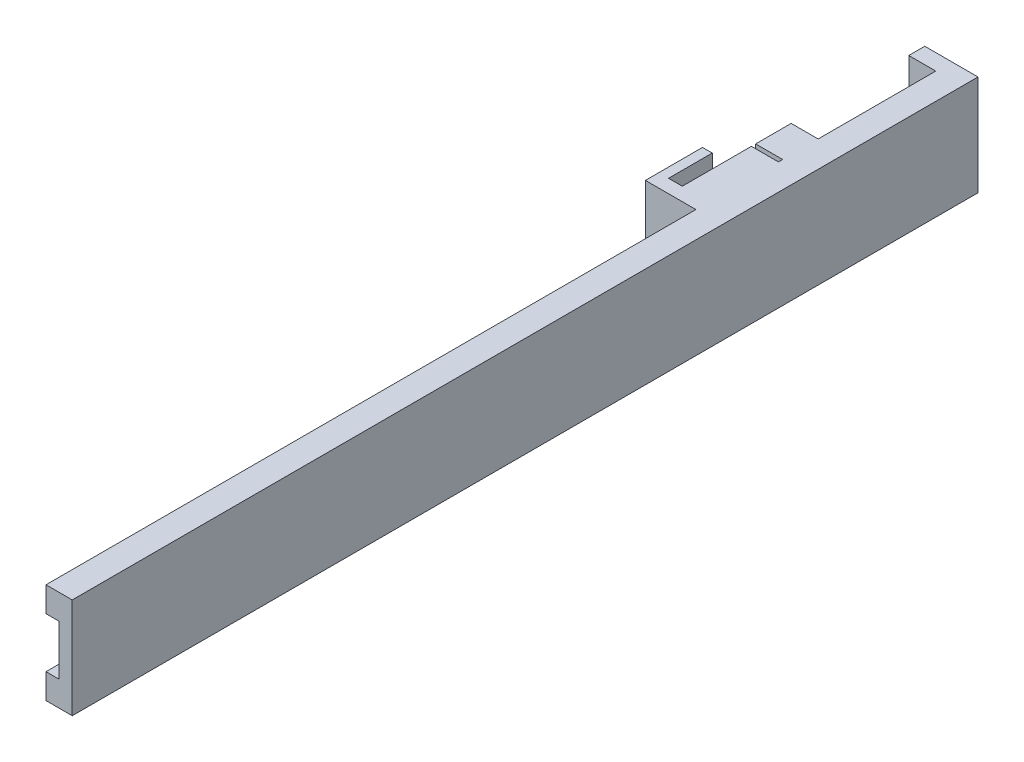
ISO-10303-21;
HEADER;
FILE_DESCRIPTION(('STEP AP214'),'2;1');
FILE_NAME('part.step','',(''),(''),'','','');
FILE_SCHEMA(('AUTOMOTIVE_DESIGN { 1 0 10303 214 1 1 1 1 }'));
ENDSEC;
DATA;
#1=APPLICATION_CONTEXT('core data for automotive mechanical design processes');
#2=APPLICATION_PROTOCOL_DEFINITION('international standard','automotive_design',2000,#1);
#3=PRODUCT_CONTEXT('',#1,'mechanical');
#4=PRODUCT('Part','Part','',(#3));
#5=PRODUCT_RELATED_PRODUCT_CATEGORY('part','',(#4));
#6=PRODUCT_DEFINITION_FORMATION('','',#4);
#7=PRODUCT_DEFINITION_CONTEXT('part definition',#1,'design');
#8=PRODUCT_DEFINITION('design','',#6,#7);
#9=PRODUCT_DEFINITION_SHAPE('','',#8);
#10=(LENGTH_UNIT() NAMED_UNIT(*) SI_UNIT(.MILLI.,.METRE.));
#11=(NAMED_UNIT(*) PLANE_ANGLE_UNIT() SI_UNIT($,.RADIAN.));
#12=(NAMED_UNIT(*) SI_UNIT($,.STERADIAN.) SOLID_ANGLE_UNIT());
#13=UNCERTAINTY_MEASURE_WITH_UNIT(LENGTH_MEASURE(1.E-05),#10,'distance_accuracy_value','');
#14=(GEOMETRIC_REPRESENTATION_CONTEXT(3) GLOBAL_UNCERTAINTY_ASSIGNED_CONTEXT((#13)) GLOBAL_UNIT_ASSIGNED_CONTEXT((#10,
#11,#12)) REPRESENTATION_CONTEXT('',''));
#15=CARTESIAN_POINT('',(0.,0.,0.));
#16=DIRECTION('',(0.,0.,1.));
#17=DIRECTION('',(1.,0.,0.));
#18=AXIS2_PLACEMENT_3D('',#15,#16,#17);
#19=CARTESIAN_POINT('',(5.86964679662599,11.6586,0.));
#20=DIRECTION('',(-1.,0.,0.));
#21=DIRECTION('',(0.,0.,1.));
#22=AXIS2_PLACEMENT_3D('',#19,#20,#21);
#23=PLANE('',#22);
#24=DIRECTION('',(0.,1.,0.));
#25=VECTOR('',#24,1.);
#26=CARTESIAN_POINT('',(5.86964679662599,11.6586,51.6734002204515));
#27=LINE('',#26,#25);
#28=CARTESIAN_POINT('',(5.86964679662599,2.91465,51.6734002204515));
#29=VERTEX_POINT('',#28);
#30=CARTESIAN_POINT('',(5.86964679662599,8.74395,51.6734002204515));
#31=VERTEX_POINT('',#30);
#32=EDGE_CURVE('E190',#29,#31,#27,.T.);
#33=ORIENTED_EDGE('',*,*,#32,.T.);
#34=DIRECTION('',(0.,0.,1.));
#35=VECTOR('',#34,1.);
#36=CARTESIAN_POINT('',(5.86964679662599,8.74395,51.6734002204515));
#37=LINE('',#36,#35);
#38=CARTESIAN_POINT('',(5.86964679662599,8.74395,77.0734002204515));
#39=VERTEX_POINT('',#38);
#40=EDGE_CURVE('E196',#31,#39,#37,.T.);
#41=ORIENTED_EDGE('',*,*,#40,.T.);
#42=DIRECTION('',(0.,-1.,0.));
#43=VECTOR('',#42,1.);
#44=CARTESIAN_POINT('',(5.86964679662599,11.6586,77.0734002204515));
#45=LINE('',#44,#43);
#46=CARTESIAN_POINT('',(5.86964679662599,11.6586,77.0734002204515));
#47=VERTEX_POINT('',#46);
#48=EDGE_CURVE('E342',#47,#39,#45,.T.);
#49=ORIENTED_EDGE('',*,*,#48,.F.);
#50=DIRECTION('',(0.,0.,-1.));
#51=VECTOR('',#50,1.);
#52=CARTESIAN_POINT('',(5.86964679662599,11.6586,0.));
#53=LINE('',#52,#51);
#54=CARTESIAN_POINT('',(5.86964679662599,11.6586,1.55606424717921));
#55=VERTEX_POINT('',#54);
#56=EDGE_CURVE('E267',#47,#55,#53,.T.);
#57=ORIENTED_EDGE('',*,*,#56,.T.);
#58=DIRECTION('',(0.,-1.,0.));
#59=VECTOR('',#58,1.);
#60=CARTESIAN_POINT('',(5.86964679662599,11.6586,1.55606424717921));
#61=LINE('',#60,#59);
#62=CARTESIAN_POINT('',(5.86964679662599,0.,1.55606424717921));
#63=VERTEX_POINT('',#62);
#64=EDGE_CURVE('E344',#55,#63,#61,.T.);
#65=ORIENTED_EDGE('',*,*,#64,.T.);
#66=DIRECTION('',(0.,0.,-1.));
#67=VECTOR('',#66,1.);
#68=CARTESIAN_POINT('',(5.86964679662599,0.,0.));
#69=LINE('',#68,#67);
#70=CARTESIAN_POINT('',(5.86964679662599,0.,77.0734002204515));
#71=VERTEX_POINT('',#70);
#72=EDGE_CURVE('E310',#71,#63,#69,.T.);
#73=ORIENTED_EDGE('',*,*,#72,.F.);
#74=CARTESIAN_POINT('',(5.86964679662599,2.91465,77.0734002204515));
#75=VERTEX_POINT('',#74);
#76=EDGE_CURVE('E341',#75,#71,#45,.T.);
#77=ORIENTED_EDGE('',*,*,#76,.F.);
#78=DIRECTION('',(0.,0.,1.));
#79=VECTOR('',#78,1.);
#80=CARTESIAN_POINT('',(5.86964679662599,2.91465,51.6734002204515));
#81=LINE('',#80,#79);
#82=EDGE_CURVE('E49',#29,#75,#81,.T.);
#83=ORIENTED_EDGE('',*,*,#82,.F.);
#84=EDGE_LOOP('',(#33,#41,#49,#57,#65,#73,#77,#83));
#85=FACE_BOUND('',#84,.T.);
#86=ADVANCED_FACE('F34',(#85),#23,.T.);
#87=CARTESIAN_POINT('',(0.,11.6586,77.0734002204515));
#88=DIRECTION('',(0.,0.,1.));
#89=DIRECTION('',(1.,0.,0.));
#90=AXIS2_PLACEMENT_3D('',#87,#88,#89);
#91=PLANE('',#90);
#92=ORIENTED_EDGE('',*,*,#48,.T.);
#93=DIRECTION('',(1.,0.,0.));
#94=VECTOR('',#93,1.);
#95=CARTESIAN_POINT('',(0.,8.74395,77.0734002204515));
#96=LINE('',#95,#94);
#97=CARTESIAN_POINT('',(7.39364679662599,8.74395,77.0734002204515));
#98=VERTEX_POINT('',#97);
#99=EDGE_CURVE('E199',#39,#98,#96,.T.);
#100=ORIENTED_EDGE('',*,*,#99,.T.);
#101=DIRECTION('',(0.,-1.,0.));
#102=VECTOR('',#101,1.);
#103=CARTESIAN_POINT('',(7.39364679662599,11.6586,77.0734002204515));
#104=LINE('',#103,#102);
#105=CARTESIAN_POINT('',(7.39364679662599,2.91465,77.0734002204515));
#106=VERTEX_POINT('',#105);
#107=EDGE_CURVE('E208',#98,#106,#104,.T.);
#108=ORIENTED_EDGE('',*,*,#107,.T.);
#109=DIRECTION('',(-1.,0.,0.));
#110=VECTOR('',#109,1.);
#111=CARTESIAN_POINT('',(0.,2.91465,77.0734002204515));
#112=LINE('',#111,#110);
#113=EDGE_CURVE('E206',#106,#75,#112,.T.);
#114=ORIENTED_EDGE('',*,*,#113,.T.);
#115=ORIENTED_EDGE('',*,*,#76,.T.);
#116=DIRECTION('',(-1.,0.,0.));
#117=VECTOR('',#116,1.);
#118=CARTESIAN_POINT('',(0.,0.,77.0734002204515));
#119=LINE('',#118,#117);
#120=CARTESIAN_POINT('',(8.91764679662599,0.,77.0734002204515));
#121=VERTEX_POINT('',#120);
#122=EDGE_CURVE('E313',#121,#71,#119,.T.);
#123=ORIENTED_EDGE('',*,*,#122,.F.);
#124=DIRECTION('',(0.,-1.,0.));
#125=VECTOR('',#124,1.);
#126=CARTESIAN_POINT('',(8.91764679662599,11.6586,77.0734002204515));
#127=LINE('',#126,#125);
#128=CARTESIAN_POINT('',(8.91764679662599,11.6586,77.0734002204515));
#129=VERTEX_POINT('',#128);
#130=EDGE_CURVE('E339',#129,#121,#127,.T.);
#131=ORIENTED_EDGE('',*,*,#130,.F.);
#132=DIRECTION('',(-1.,0.,0.));
#133=VECTOR('',#132,1.);
#134=CARTESIAN_POINT('',(0.,11.6586,77.0734002204515));
#135=LINE('',#134,#133);
#136=EDGE_CURVE('E270',#129,#47,#135,.T.);
#137=ORIENTED_EDGE('',*,*,#136,.T.);
#138=EDGE_LOOP('',(#92,#100,#108,#114,#115,#123,#131,#137));
#139=FACE_BOUND('',#138,.T.);
#140=ADVANCED_FACE('F392',(#139),#91,.T.);
#141=CARTESIAN_POINT('',(2.73274679662599,11.6586,0.));
#142=DIRECTION('',(-1.,0.,0.));
#143=DIRECTION('',(0.,0.,1.));
#144=AXIS2_PLACEMENT_3D('',#141,#142,#143);
#145=PLANE('',#144);
#146=DIRECTION('',(0.,0.,-1.));
#147=VECTOR('',#146,1.);
#148=CARTESIAN_POINT('',(2.73274679662599,0.,0.));
#149=LINE('',#148,#147);
#150=CARTESIAN_POINT('',(2.73274679662599,0.,-8.5217));
#151=VERTEX_POINT('',#150);
#152=CARTESIAN_POINT('',(2.73274679662599,0.,-12.6492));
#153=VERTEX_POINT('',#152);
#154=EDGE_CURVE('E291',#151,#153,#149,.T.);
#155=ORIENTED_EDGE('',*,*,#154,.F.);
#156=DIRECTION('',(0.,-1.,0.));
#157=VECTOR('',#156,1.);
#158=CARTESIAN_POINT('',(2.73274679662599,11.6586,-8.5217));
#159=LINE('',#158,#157);
#160=CARTESIAN_POINT('',(2.73274679662599,11.6586,-8.5217));
#161=VERTEX_POINT('',#160);
#162=EDGE_CURVE('E57',#161,#151,#159,.T.);
#163=ORIENTED_EDGE('',*,*,#162,.F.);
#164=DIRECTION('',(0.,0.,-1.));
#165=VECTOR('',#164,1.);
#166=CARTESIAN_POINT('',(2.73274679662599,11.6586,0.));
#167=LINE('',#166,#165);
#168=CARTESIAN_POINT('',(2.73274679662599,11.6586,-12.6492));
#169=VERTEX_POINT('',#168);
#170=EDGE_CURVE('E247',#161,#169,#167,.T.);
#171=ORIENTED_EDGE('',*,*,#170,.T.);
#172=DIRECTION('',(0.,-1.,0.));
#173=VECTOR('',#172,1.);
#174=CARTESIAN_POINT('',(2.73274679662599,11.6586,-12.6492));
#175=LINE('',#174,#173);
#176=EDGE_CURVE('E11',#169,#153,#175,.T.);
#177=ORIENTED_EDGE('',*,*,#176,.T.);
#178=EDGE_LOOP('',(#155,#163,#171,#177));
#179=FACE_BOUND('',#178,.T.);
#180=ADVANCED_FACE('F397',(#179),#145,.T.);
#181=CARTESIAN_POINT('',(0.,11.6586,-12.6492));
#182=DIRECTION('',(0.,0.,-1.));
#183=DIRECTION('',(-1.,0.,0.));
#184=AXIS2_PLACEMENT_3D('',#181,#182,#183);
#185=PLANE('',#184);
#186=DIRECTION('',(1.,0.,0.));
#187=VECTOR('',#186,1.);
#188=CARTESIAN_POINT('',(0.,0.,-12.6492));
#189=LINE('',#188,#187);
#190=CARTESIAN_POINT('',(5.86964679662599,0.,-12.6492));
#191=VERTEX_POINT('',#190);
#192=EDGE_CURVE('E243',#153,#191,#189,.T.);
#193=ORIENTED_EDGE('',*,*,#192,.F.);
#194=ORIENTED_EDGE('',*,*,#176,.F.);
#195=DIRECTION('',(1.,0.,0.));
#196=VECTOR('',#195,1.);
#197=CARTESIAN_POINT('',(0.,11.6586,-12.6492));
#198=LINE('',#197,#196);
#199=CARTESIAN_POINT('',(5.86964679662599,11.6586,-12.6492));
#200=VERTEX_POINT('',#199);
#201=EDGE_CURVE('E244',#169,#200,#198,.T.);
#202=ORIENTED_EDGE('',*,*,#201,.T.);
#203=DIRECTION('',(0.,-1.,0.));
#204=VECTOR('',#203,1.);
#205=CARTESIAN_POINT('',(5.86964679662599,11.6586,-12.6492));
#206=LINE('',#205,#204);
#207=EDGE_CURVE('E288',#200,#191,#206,.T.);
#208=ORIENTED_EDGE('',*,*,#207,.T.);
#209=EDGE_LOOP('',(#193,#194,#202,#208));
#210=FACE_BOUND('',#209,.T.);
#211=ADVANCED_FACE('F36',(#210),#185,.T.);
#212=DIRECTION('',(0.,-1.,0.));
#213=VECTOR('',#212,1.);
#214=CARTESIAN_POINT('',(2.73274679662599,11.6586,-8.03014983470572));
#215=LINE('',#214,#213);
#216=CARTESIAN_POINT('',(2.73274679662599,11.6586,-8.03014983470572));
#217=VERTEX_POINT('',#216);
#218=CARTESIAN_POINT('',(2.73274679662599,0.,-8.03014983470572));
#219=VERTEX_POINT('',#218);
#220=EDGE_CURVE('E230',#217,#219,#215,.T.);
#221=ORIENTED_EDGE('',*,*,#220,.T.);
#222=CARTESIAN_POINT('',(2.73274679662599,0.,0.));
#223=VERTEX_POINT('',#222);
#224=EDGE_CURVE('E292',#223,#219,#149,.T.);
#225=ORIENTED_EDGE('',*,*,#224,.F.);
#226=DIRECTION('',(0.,-1.,0.));
#227=VECTOR('',#226,1.);
#228=CARTESIAN_POINT('',(2.73274679662599,11.6586,0.));
#229=LINE('',#228,#227);
#230=CARTESIAN_POINT('',(2.73274679662599,11.6586,0.));
#231=VERTEX_POINT('',#230);
#232=EDGE_CURVE('E42',#231,#223,#229,.T.);
#233=ORIENTED_EDGE('',*,*,#232,.F.);
#234=EDGE_CURVE('E249',#231,#217,#167,.T.);
#235=ORIENTED_EDGE('',*,*,#234,.T.);
#236=EDGE_LOOP('',(#221,#225,#233,#235));
#237=FACE_BOUND('',#236,.T.);
#238=ADVANCED_FACE('F360',(#237),#145,.T.);
#239=CARTESIAN_POINT('',(0.,11.6586,0.));
#240=DIRECTION('',(0.,0.,-1.));
#241=DIRECTION('',(-1.,0.,0.));
#242=AXIS2_PLACEMENT_3D('',#239,#240,#241);
#243=PLANE('',#242);
#244=DIRECTION('',(1.,0.,0.));
#245=VECTOR('',#244,1.);
#246=CARTESIAN_POINT('',(0.,0.,0.));
#247=LINE('',#246,#245);
#248=CARTESIAN_POINT('',(1.13254679662599,0.,0.));
#249=VERTEX_POINT('',#248);
#250=EDGE_CURVE('E295',#249,#223,#247,.T.);
#251=ORIENTED_EDGE('',*,*,#250,.F.);
#252=DIRECTION('',(0.,-1.,0.));
#253=VECTOR('',#252,1.);
#254=CARTESIAN_POINT('',(1.13254679662599,11.6586,0.));
#255=LINE('',#254,#253);
#256=CARTESIAN_POINT('',(1.13254679662599,11.6586,0.));
#257=VERTEX_POINT('',#256);
#258=EDGE_CURVE('E352',#257,#249,#255,.T.);
#259=ORIENTED_EDGE('',*,*,#258,.F.);
#260=DIRECTION('',(1.,0.,0.));
#261=VECTOR('',#260,1.);
#262=CARTESIAN_POINT('',(0.,11.6586,0.));
#263=LINE('',#262,#261);
#264=EDGE_CURVE('E252',#257,#231,#263,.T.);
#265=ORIENTED_EDGE('',*,*,#264,.T.);
#266=ORIENTED_EDGE('',*,*,#232,.T.);
#267=EDGE_LOOP('',(#251,#259,#265,#266));
#268=FACE_BOUND('',#267,.T.);
#269=ADVANCED_FACE('F356',(#268),#243,.T.);
#270=CARTESIAN_POINT('',(1.13254679662599,11.6586,0.));
#271=DIRECTION('',(1.,0.,0.));
#272=DIRECTION('',(0.,0.,-1.));
#273=AXIS2_PLACEMENT_3D('',#270,#271,#272);
#274=PLANE('',#273);
#275=DIRECTION('',(0.,0.,1.));
#276=VECTOR('',#275,1.);
#277=CARTESIAN_POINT('',(1.13254679662599,0.,0.));
#278=LINE('',#277,#276);
#279=CARTESIAN_POINT('',(1.13254679662599,0.,-5.08));
#280=VERTEX_POINT('',#279);
#281=EDGE_CURVE('E298',#280,#249,#278,.T.);
#282=ORIENTED_EDGE('',*,*,#281,.F.);
#283=DIRECTION('',(0.,-1.,0.));
#284=VECTOR('',#283,1.);
#285=CARTESIAN_POINT('',(1.13254679662599,11.6586,-5.08));
#286=LINE('',#285,#284);
#287=CARTESIAN_POINT('',(1.13254679662599,11.6586,-5.08));
#288=VERTEX_POINT('',#287);
#289=EDGE_CURVE('E350',#288,#280,#286,.T.);
#290=ORIENTED_EDGE('',*,*,#289,.F.);
#291=DIRECTION('',(0.,0.,1.));
#292=VECTOR('',#291,1.);
#293=CARTESIAN_POINT('',(1.13254679662599,11.6586,0.));
#294=LINE('',#293,#292);
#295=EDGE_CURVE('E255',#288,#257,#294,.T.);
#296=ORIENTED_EDGE('',*,*,#295,.T.);
#297=ORIENTED_EDGE('',*,*,#258,.T.);
#298=EDGE_LOOP('',(#282,#290,#296,#297));
#299=FACE_BOUND('',#298,.T.);
#300=ADVANCED_FACE('F367',(#299),#274,.T.);
#301=CARTESIAN_POINT('',(0.,11.6586,-5.08));
#302=DIRECTION('',(0.,0.,-1.));
#303=DIRECTION('',(-1.,0.,0.));
#304=AXIS2_PLACEMENT_3D('',#301,#302,#303);
#305=PLANE('',#304);
#306=DIRECTION('',(1.,0.,0.));
#307=VECTOR('',#306,1.);
#308=CARTESIAN_POINT('',(0.,0.,-5.08));
#309=LINE('',#308,#307);
#310=CARTESIAN_POINT('',(0.,0.,-5.08));
#311=VERTEX_POINT('',#310);
#312=EDGE_CURVE('E301',#311,#280,#309,.T.);
#313=ORIENTED_EDGE('',*,*,#312,.F.);
#314=DIRECTION('',(0.,-1.,0.));
#315=VECTOR('',#314,1.);
#316=CARTESIAN_POINT('',(0.,11.6586,-5.08));
#317=LINE('',#316,#315);
#318=CARTESIAN_POINT('',(0.,11.6586,-5.08));
#319=VERTEX_POINT('',#318);
#320=EDGE_CURVE('E348',#319,#311,#317,.T.);
#321=ORIENTED_EDGE('',*,*,#320,.F.);
#322=DIRECTION('',(1.,0.,0.));
#323=VECTOR('',#322,1.);
#324=CARTESIAN_POINT('',(0.,11.6586,-5.08));
#325=LINE('',#324,#323);
#326=EDGE_CURVE('E258',#319,#288,#325,.T.);
#327=ORIENTED_EDGE('',*,*,#326,.T.);
#328=ORIENTED_EDGE('',*,*,#289,.T.);
#329=EDGE_LOOP('',(#313,#321,#327,#328));
#330=FACE_BOUND('',#329,.T.);
#331=ADVANCED_FACE('F410',(#330),#305,.T.);
#332=CARTESIAN_POINT('',(0.,11.6586,0.));
#333=DIRECTION('',(-1.,0.,0.));
#334=DIRECTION('',(0.,0.,1.));
#335=AXIS2_PLACEMENT_3D('',#332,#333,#334);
#336=PLANE('',#335);
#337=DIRECTION('',(0.,0.,-1.));
#338=VECTOR('',#337,1.);
#339=CARTESIAN_POINT('',(0.,0.,0.));
#340=LINE('',#339,#338);
#341=CARTESIAN_POINT('',(0.,0.,1.55606424717921));
#342=VERTEX_POINT('',#341);
#343=EDGE_CURVE('E304',#342,#311,#340,.T.);
#344=ORIENTED_EDGE('',*,*,#343,.F.);
#345=DIRECTION('',(0.,-1.,0.));
#346=VECTOR('',#345,1.);
#347=CARTESIAN_POINT('',(0.,11.6586,1.55606424717921));
#348=LINE('',#347,#346);
#349=CARTESIAN_POINT('',(0.,11.6586,1.55606424717921));
#350=VERTEX_POINT('',#349);
#351=EDGE_CURVE('E346',#350,#342,#348,.T.);
#352=ORIENTED_EDGE('',*,*,#351,.F.);
#353=DIRECTION('',(0.,0.,-1.));
#354=VECTOR('',#353,1.);
#355=CARTESIAN_POINT('',(0.,11.6586,0.));
#356=LINE('',#355,#354);
#357=EDGE_CURVE('E261',#350,#319,#356,.T.);
#358=ORIENTED_EDGE('',*,*,#357,.T.);
#359=ORIENTED_EDGE('',*,*,#320,.T.);
#360=EDGE_LOOP('',(#344,#352,#358,#359));
#361=FACE_BOUND('',#360,.T.);
#362=ADVANCED_FACE('F406',(#361),#336,.T.);
#363=CARTESIAN_POINT('',(0.,11.6586,1.55606424717921));
#364=DIRECTION('',(0.,0.,1.));
#365=DIRECTION('',(1.,0.,0.));
#366=AXIS2_PLACEMENT_3D('',#363,#364,#365);
#367=PLANE('',#366);
#368=DIRECTION('',(-1.,0.,0.));
#369=VECTOR('',#368,1.);
#370=CARTESIAN_POINT('',(0.,0.,1.55606424717921));
#371=LINE('',#370,#369);
#372=EDGE_CURVE('E307',#63,#342,#371,.T.);
#373=ORIENTED_EDGE('',*,*,#372,.F.);
#374=ORIENTED_EDGE('',*,*,#64,.F.);
#375=DIRECTION('',(-1.,0.,0.));
#376=VECTOR('',#375,1.);
#377=CARTESIAN_POINT('',(0.,11.6586,1.55606424717921));
#378=LINE('',#377,#376);
#379=EDGE_CURVE('E264',#55,#350,#378,.T.);
#380=ORIENTED_EDGE('',*,*,#379,.T.);
#381=ORIENTED_EDGE('',*,*,#351,.T.);
#382=EDGE_LOOP('',(#373,#374,#380,#381));
#383=FACE_BOUND('',#382,.T.);
#384=ADVANCED_FACE('F402',(#383),#367,.T.);
#385=CARTESIAN_POINT('',(8.91764679662598,11.6586,0.));
#386=DIRECTION('',(1.,0.,0.));
#387=DIRECTION('',(0.,0.,-1.));
#388=AXIS2_PLACEMENT_3D('',#385,#386,#387);
#389=PLANE('',#388);
#390=DIRECTION('',(0.,0.,1.));
#391=VECTOR('',#390,1.);
#392=CARTESIAN_POINT('',(8.91764679662598,0.,0.));
#393=LINE('',#392,#391);
#394=CARTESIAN_POINT('',(8.91764679662597,0.,-28.1739089256451));
#395=VERTEX_POINT('',#394);
#396=EDGE_CURVE('E316',#395,#121,#393,.T.);
#397=ORIENTED_EDGE('',*,*,#396,.F.);
#398=DIRECTION('',(0.,-1.,0.));
#399=VECTOR('',#398,1.);
#400=CARTESIAN_POINT('',(8.91764679662597,11.6586,-28.1739089256451));
#401=LINE('',#400,#399);
#402=CARTESIAN_POINT('',(8.91764679662597,11.6586,-28.1739089256451));
#403=VERTEX_POINT('',#402);
#404=EDGE_CURVE('E337',#403,#395,#401,.T.);
#405=ORIENTED_EDGE('',*,*,#404,.F.);
#406=DIRECTION('',(0.,0.,1.));
#407=VECTOR('',#406,1.);
#408=CARTESIAN_POINT('',(8.91764679662598,11.6586,0.));
#409=LINE('',#408,#407);
#410=EDGE_CURVE('E273',#403,#129,#409,.T.);
#411=ORIENTED_EDGE('',*,*,#410,.T.);
#412=ORIENTED_EDGE('',*,*,#130,.T.);
#413=EDGE_LOOP('',(#397,#405,#411,#412));
#414=FACE_BOUND('',#413,.T.);
#415=ADVANCED_FACE('F405',(#414),#389,.T.);
#416=CARTESIAN_POINT('',(0.,11.6586,-28.1739089256451));
#417=DIRECTION('',(0.,0.,-1.));
#418=DIRECTION('',(-1.,0.,0.));
#419=AXIS2_PLACEMENT_3D('',#416,#417,#418);
#420=PLANE('',#419);
#421=DIRECTION('',(1.,0.,0.));
#422=VECTOR('',#421,1.);
#423=CARTESIAN_POINT('',(0.,0.,-28.1739089256451));
#424=LINE('',#423,#422);
#425=CARTESIAN_POINT('',(2.73274679662599,0.,-28.1739089256451));
#426=VERTEX_POINT('',#425);
#427=EDGE_CURVE('E319',#426,#395,#424,.T.);
#428=ORIENTED_EDGE('',*,*,#427,.F.);
#429=DIRECTION('',(0.,-1.,0.));
#430=VECTOR('',#429,1.);
#431=CARTESIAN_POINT('',(2.73274679662599,11.6586,-28.1739089256451));
#432=LINE('',#431,#430);
#433=CARTESIAN_POINT('',(2.73274679662599,11.6586,-28.1739089256451));
#434=VERTEX_POINT('',#433);
#435=EDGE_CURVE('E335',#434,#426,#432,.T.);
#436=ORIENTED_EDGE('',*,*,#435,.F.);
#437=DIRECTION('',(1.,0.,0.));
#438=VECTOR('',#437,1.);
#439=CARTESIAN_POINT('',(0.,11.6586,-28.1739089256451));
#440=LINE('',#439,#438);
#441=EDGE_CURVE('E276',#434,#403,#440,.T.);
#442=ORIENTED_EDGE('',*,*,#441,.T.);
#443=ORIENTED_EDGE('',*,*,#404,.T.);
#444=EDGE_LOOP('',(#428,#436,#442,#443));
#445=FACE_BOUND('',#444,.T.);
#446=ADVANCED_FACE('F445',(#445),#420,.T.);
#447=CARTESIAN_POINT('',(2.73274679662599,11.6586,0.));
#448=DIRECTION('',(-1.,0.,0.));
#449=DIRECTION('',(0.,0.,1.));
#450=AXIS2_PLACEMENT_3D('',#447,#448,#449);
#451=PLANE('',#450);
#452=DIRECTION('',(0.,0.,-1.));
#453=VECTOR('',#452,1.);
#454=CARTESIAN_POINT('',(2.73274679662599,0.,0.));
#455=LINE('',#454,#453);
#456=CARTESIAN_POINT('',(2.73274679662599,0.,-26.3144));
#457=VERTEX_POINT('',#456);
#458=EDGE_CURVE('E322',#457,#426,#455,.T.);
#459=ORIENTED_EDGE('',*,*,#458,.F.);
#460=DIRECTION('',(0.,-1.,0.));
#461=VECTOR('',#460,1.);
#462=CARTESIAN_POINT('',(2.73274679662599,11.6586,-26.3144));
#463=LINE('',#462,#461);
#464=CARTESIAN_POINT('',(2.73274679662599,11.6586,-26.3144));
#465=VERTEX_POINT('',#464);
#466=EDGE_CURVE('E333',#465,#457,#463,.T.);
#467=ORIENTED_EDGE('',*,*,#466,.F.);
#468=DIRECTION('',(0.,0.,-1.));
#469=VECTOR('',#468,1.);
#470=CARTESIAN_POINT('',(2.73274679662599,11.6586,0.));
#471=LINE('',#470,#469);
#472=EDGE_CURVE('E279',#465,#434,#471,.T.);
#473=ORIENTED_EDGE('',*,*,#472,.T.);
#474=ORIENTED_EDGE('',*,*,#435,.T.);
#475=EDGE_LOOP('',(#459,#467,#473,#474));
#476=FACE_BOUND('',#475,.T.);
#477=ADVANCED_FACE('F441',(#476),#451,.T.);
#478=CARTESIAN_POINT('',(0.,11.6586,-26.3144));
#479=DIRECTION('',(0.,0.,1.));
#480=DIRECTION('',(1.,0.,0.));
#481=AXIS2_PLACEMENT_3D('',#478,#479,#480);
#482=PLANE('',#481);
#483=DIRECTION('',(-1.,0.,0.));
#484=VECTOR('',#483,1.);
#485=CARTESIAN_POINT('',(0.,0.,-26.3144));
#486=LINE('',#485,#484);
#487=CARTESIAN_POINT('',(5.86964679662599,0.,-26.3144));
#488=VERTEX_POINT('',#487);
#489=EDGE_CURVE('E325',#488,#457,#486,.T.);
#490=ORIENTED_EDGE('',*,*,#489,.F.);
#491=DIRECTION('',(0.,-1.,0.));
#492=VECTOR('',#491,1.);
#493=CARTESIAN_POINT('',(5.86964679662599,11.6586,-26.3144));
#494=LINE('',#493,#492);
#495=CARTESIAN_POINT('',(5.86964679662599,11.6586,-26.3144));
#496=VERTEX_POINT('',#495);
#497=EDGE_CURVE('E331',#496,#488,#494,.T.);
#498=ORIENTED_EDGE('',*,*,#497,.F.);
#499=DIRECTION('',(-1.,0.,0.));
#500=VECTOR('',#499,1.);
#501=CARTESIAN_POINT('',(0.,11.6586,-26.3144));
#502=LINE('',#501,#500);
#503=EDGE_CURVE('E282',#496,#465,#502,.T.);
#504=ORIENTED_EDGE('',*,*,#503,.T.);
#505=ORIENTED_EDGE('',*,*,#466,.T.);
#506=EDGE_LOOP('',(#490,#498,#504,#505));
#507=FACE_BOUND('',#506,.T.);
#508=ADVANCED_FACE('F437',(#507),#482,.T.);
#509=CARTESIAN_POINT('',(5.86964679662599,11.6586,0.));
#510=DIRECTION('',(-1.,0.,0.));
#511=DIRECTION('',(0.,0.,1.));
#512=AXIS2_PLACEMENT_3D('',#509,#510,#511);
#513=PLANE('',#512);
#514=DIRECTION('',(0.,0.,-1.));
#515=VECTOR('',#514,1.);
#516=CARTESIAN_POINT('',(5.86964679662599,0.,0.));
#517=LINE('',#516,#515);
#518=EDGE_CURVE('E248',#191,#488,#517,.T.);
#519=ORIENTED_EDGE('',*,*,#518,.F.);
#520=ORIENTED_EDGE('',*,*,#207,.F.);
#521=DIRECTION('',(0.,0.,-1.));
#522=VECTOR('',#521,1.);
#523=CARTESIAN_POINT('',(5.86964679662599,11.6586,0.));
#524=LINE('',#523,#522);
#525=EDGE_CURVE('E285',#200,#496,#524,.T.);
#526=ORIENTED_EDGE('',*,*,#525,.T.);
#527=ORIENTED_EDGE('',*,*,#497,.T.);
#528=EDGE_LOOP('',(#519,#520,#526,#527));
#529=FACE_BOUND('',#528,.T.);
#530=ADVANCED_FACE('F432',(#529),#513,.T.);
#531=CARTESIAN_POINT('',(0.,11.6586,0.));
#532=DIRECTION('',(0.,1.,0.));
#533=DIRECTION('',(0.,0.,1.));
#534=AXIS2_PLACEMENT_3D('',#531,#532,#533);
#535=PLANE('',#534);
#536=DIRECTION('',(-1.,0.,0.));
#537=VECTOR('',#536,1.);
#538=CARTESIAN_POINT('',(0.,11.6586,-8.03014983470572));
#539=LINE('',#538,#537);
#540=CARTESIAN_POINT('',(5.86964679662599,11.6586,-8.03014983470572));
#541=VERTEX_POINT('',#540);
#542=EDGE_CURVE('E221',#541,#217,#539,.T.);
#543=ORIENTED_EDGE('',*,*,#542,.T.);
#544=ORIENTED_EDGE('',*,*,#234,.F.);
#545=ORIENTED_EDGE('',*,*,#264,.F.);
#546=ORIENTED_EDGE('',*,*,#295,.F.);
#547=ORIENTED_EDGE('',*,*,#326,.F.);
#548=ORIENTED_EDGE('',*,*,#357,.F.);
#549=ORIENTED_EDGE('',*,*,#379,.F.);
#550=ORIENTED_EDGE('',*,*,#56,.F.);
#551=ORIENTED_EDGE('',*,*,#136,.F.);
#552=ORIENTED_EDGE('',*,*,#410,.F.);
#553=ORIENTED_EDGE('',*,*,#441,.F.);
#554=ORIENTED_EDGE('',*,*,#472,.F.);
#555=ORIENTED_EDGE('',*,*,#503,.F.);
#556=ORIENTED_EDGE('',*,*,#525,.F.);
#557=ORIENTED_EDGE('',*,*,#201,.F.);
#558=ORIENTED_EDGE('',*,*,#170,.F.);
#559=DIRECTION('',(-1.,0.,0.));
#560=VECTOR('',#559,1.);
#561=CARTESIAN_POINT('',(0.,11.6586,-8.5217));
#562=LINE('',#561,#560);
#563=CARTESIAN_POINT('',(5.86964679662599,11.6586,-8.5217));
#564=VERTEX_POINT('',#563);
#565=EDGE_CURVE('E228',#564,#161,#562,.T.);
#566=ORIENTED_EDGE('',*,*,#565,.F.);
#567=DIRECTION('',(0.,0.,1.));
#568=VECTOR('',#567,1.);
#569=CARTESIAN_POINT('',(5.86964679662599,11.6586,0.));
#570=LINE('',#569,#568);
#571=EDGE_CURVE('E224',#564,#541,#570,.T.);
#572=ORIENTED_EDGE('',*,*,#571,.T.);
#573=EDGE_LOOP('',(#543,#544,#545,#546,#547,#548,#549,#550,#551,#552,#553,#554,#555,#556,#557,
#558,#566,#572));
#574=FACE_BOUND('',#573,.T.);
#575=ADVANCED_FACE('F370',(#574),#535,.T.);
#576=CARTESIAN_POINT('',(0.,0.,0.));
#577=DIRECTION('',(0.,1.,0.));
#578=DIRECTION('',(0.,0.,1.));
#579=AXIS2_PLACEMENT_3D('',#576,#577,#578);
#580=PLANE('',#579);
#581=ORIENTED_EDGE('',*,*,#224,.T.);
#582=DIRECTION('',(-1.,0.,0.));
#583=VECTOR('',#582,1.);
#584=CARTESIAN_POINT('',(0.,0.,-8.03014983470572));
#585=LINE('',#584,#583);
#586=CARTESIAN_POINT('',(5.86964679662599,0.,-8.03014983470572));
#587=VERTEX_POINT('',#586);
#588=EDGE_CURVE('E202',#587,#219,#585,.T.);
#589=ORIENTED_EDGE('',*,*,#588,.F.);
#590=DIRECTION('',(0.,0.,1.));
#591=VECTOR('',#590,1.);
#592=CARTESIAN_POINT('',(5.86964679662599,0.,0.));
#593=LINE('',#592,#591);
#594=CARTESIAN_POINT('',(5.86964679662599,0.,-8.5217));
#595=VERTEX_POINT('',#594);
#596=EDGE_CURVE('E232',#595,#587,#593,.T.);
#597=ORIENTED_EDGE('',*,*,#596,.F.);
#598=DIRECTION('',(-1.,0.,0.));
#599=VECTOR('',#598,1.);
#600=CARTESIAN_POINT('',(0.,0.,-8.5217));
#601=LINE('',#600,#599);
#602=EDGE_CURVE('E225',#595,#151,#601,.T.);
#603=ORIENTED_EDGE('',*,*,#602,.T.);
#604=ORIENTED_EDGE('',*,*,#154,.T.);
#605=ORIENTED_EDGE('',*,*,#192,.T.);
#606=ORIENTED_EDGE('',*,*,#518,.T.);
#607=ORIENTED_EDGE('',*,*,#489,.T.);
#608=ORIENTED_EDGE('',*,*,#458,.T.);
#609=ORIENTED_EDGE('',*,*,#427,.T.);
#610=ORIENTED_EDGE('',*,*,#396,.T.);
#611=ORIENTED_EDGE('',*,*,#122,.T.);
#612=ORIENTED_EDGE('',*,*,#72,.T.);
#613=ORIENTED_EDGE('',*,*,#372,.T.);
#614=ORIENTED_EDGE('',*,*,#343,.T.);
#615=ORIENTED_EDGE('',*,*,#312,.T.);
#616=ORIENTED_EDGE('',*,*,#281,.T.);
#617=ORIENTED_EDGE('',*,*,#250,.T.);
#618=EDGE_LOOP('',(#581,#589,#597,#603,#604,#605,#606,#607,#608,#609,#610,#611,#612,#613,#614,
#615,#616,#617));
#619=FACE_BOUND('',#618,.T.);
#620=ADVANCED_FACE('F363',(#619),#580,.F.);
#621=CARTESIAN_POINT('',(0.,11.6586,-8.03014983470572));
#622=DIRECTION('',(0.,0.,1.));
#623=DIRECTION('',(1.,0.,0.));
#624=AXIS2_PLACEMENT_3D('',#621,#622,#623);
#625=PLANE('',#624);
#626=ORIENTED_EDGE('',*,*,#588,.T.);
#627=ORIENTED_EDGE('',*,*,#220,.F.);
#628=ORIENTED_EDGE('',*,*,#542,.F.);
#629=DIRECTION('',(0.,-1.,0.));
#630=VECTOR('',#629,1.);
#631=CARTESIAN_POINT('',(5.86964679662599,11.6586,-8.03014983470572));
#632=LINE('',#631,#630);
#633=EDGE_CURVE('E241',#541,#587,#632,.T.);
#634=ORIENTED_EDGE('',*,*,#633,.T.);
#635=EDGE_LOOP('',(#626,#627,#628,#634));
#636=FACE_BOUND('',#635,.T.);
#637=ADVANCED_FACE('F376',(#636),#625,.F.);
#638=CARTESIAN_POINT('',(5.86964679662599,11.6586,0.));
#639=DIRECTION('',(1.,0.,0.));
#640=DIRECTION('',(0.,0.,-1.));
#641=AXIS2_PLACEMENT_3D('',#638,#639,#640);
#642=PLANE('',#641);
#643=ORIENTED_EDGE('',*,*,#596,.T.);
#644=ORIENTED_EDGE('',*,*,#633,.F.);
#645=ORIENTED_EDGE('',*,*,#571,.F.);
#646=DIRECTION('',(0.,-1.,0.));
#647=VECTOR('',#646,1.);
#648=CARTESIAN_POINT('',(5.86964679662599,11.6586,-8.5217));
#649=LINE('',#648,#647);
#650=EDGE_CURVE('E239',#564,#595,#649,.T.);
#651=ORIENTED_EDGE('',*,*,#650,.T.);
#652=EDGE_LOOP('',(#643,#644,#645,#651));
#653=FACE_BOUND('',#652,.T.);
#654=ADVANCED_FACE('F380',(#653),#642,.F.);
#655=CARTESIAN_POINT('',(0.,11.6586,-8.5217));
#656=DIRECTION('',(0.,0.,1.));
#657=DIRECTION('',(1.,0.,0.));
#658=AXIS2_PLACEMENT_3D('',#655,#656,#657);
#659=PLANE('',#658);
#660=ORIENTED_EDGE('',*,*,#602,.F.);
#661=ORIENTED_EDGE('',*,*,#650,.F.);
#662=ORIENTED_EDGE('',*,*,#565,.T.);
#663=ORIENTED_EDGE('',*,*,#162,.T.);
#664=EDGE_LOOP('',(#660,#661,#662,#663));
#665=FACE_BOUND('',#664,.T.);
#666=ADVANCED_FACE('F381',(#665),#659,.T.);
#667=CARTESIAN_POINT('',(0.,8.74395,51.6734002204515));
#668=DIRECTION('',(0.,-1.,0.));
#669=DIRECTION('',(0.,0.,-1.));
#670=AXIS2_PLACEMENT_3D('',#667,#668,#669);
#671=PLANE('',#670);
#672=ORIENTED_EDGE('',*,*,#99,.F.);
#673=ORIENTED_EDGE('',*,*,#40,.F.);
#674=DIRECTION('',(1.,0.,0.));
#675=VECTOR('',#674,1.);
#676=CARTESIAN_POINT('',(0.,8.74395,51.6734002204515));
#677=LINE('',#676,#675);
#678=CARTESIAN_POINT('',(7.39364679662599,8.74395,51.6734002204515));
#679=VERTEX_POINT('',#678);
#680=EDGE_CURVE('E185',#31,#679,#677,.T.);
#681=ORIENTED_EDGE('',*,*,#680,.T.);
#682=DIRECTION('',(0.,0.,1.));
#683=VECTOR('',#682,1.);
#684=CARTESIAN_POINT('',(7.39364679662599,8.74395,51.6734002204515));
#685=LINE('',#684,#683);
#686=EDGE_CURVE('E203',#679,#98,#685,.T.);
#687=ORIENTED_EDGE('',*,*,#686,.T.);
#688=EDGE_LOOP('',(#672,#673,#681,#687));
#689=FACE_BOUND('',#688,.T.);
#690=ADVANCED_FACE('F197',(#689),#671,.T.);
#691=CARTESIAN_POINT('',(7.39364679662599,11.6586,51.6734002204515));
#692=DIRECTION('',(-1.,0.,0.));
#693=DIRECTION('',(0.,0.,1.));
#694=AXIS2_PLACEMENT_3D('',#691,#692,#693);
#695=PLANE('',#694);
#696=ORIENTED_EDGE('',*,*,#107,.F.);
#697=ORIENTED_EDGE('',*,*,#686,.F.);
#698=DIRECTION('',(0.,-1.,0.));
#699=VECTOR('',#698,1.);
#700=CARTESIAN_POINT('',(7.39364679662599,11.6586,51.6734002204515));
#701=LINE('',#700,#699);
#702=CARTESIAN_POINT('',(7.39364679662599,2.91465,51.6734002204515));
#703=VERTEX_POINT('',#702);
#704=EDGE_CURVE('E191',#679,#703,#701,.T.);
#705=ORIENTED_EDGE('',*,*,#704,.T.);
#706=DIRECTION('',(0.,0.,1.));
#707=VECTOR('',#706,1.);
#708=CARTESIAN_POINT('',(7.39364679662599,2.91465,51.6734002204515));
#709=LINE('',#708,#707);
#710=EDGE_CURVE('E218',#703,#106,#709,.T.);
#711=ORIENTED_EDGE('',*,*,#710,.T.);
#712=EDGE_LOOP('',(#696,#697,#705,#711));
#713=FACE_BOUND('',#712,.T.);
#714=ADVANCED_FACE('F388',(#713),#695,.T.);
#715=CARTESIAN_POINT('',(0.,2.91465,51.6734002204515));
#716=DIRECTION('',(0.,1.,0.));
#717=DIRECTION('',(0.,0.,1.));
#718=AXIS2_PLACEMENT_3D('',#715,#716,#717);
#719=PLANE('',#718);
#720=ORIENTED_EDGE('',*,*,#113,.F.);
#721=ORIENTED_EDGE('',*,*,#710,.F.);
#722=DIRECTION('',(-1.,0.,0.));
#723=VECTOR('',#722,1.);
#724=CARTESIAN_POINT('',(0.,2.91465,51.6734002204515));
#725=LINE('',#724,#723);
#726=EDGE_CURVE('E212',#703,#29,#725,.T.);
#727=ORIENTED_EDGE('',*,*,#726,.T.);
#728=ORIENTED_EDGE('',*,*,#82,.T.);
#729=EDGE_LOOP('',(#720,#721,#727,#728));
#730=FACE_BOUND('',#729,.T.);
#731=ADVANCED_FACE('F460',(#730),#719,.T.);
#732=CARTESIAN_POINT('',(0.,0.,51.6734002204515));
#733=DIRECTION('',(0.,0.,-1.));
#734=DIRECTION('',(-1.,0.,0.));
#735=AXIS2_PLACEMENT_3D('',#732,#733,#734);
#736=PLANE('',#735);
#737=ORIENTED_EDGE('',*,*,#32,.F.);
#738=ORIENTED_EDGE('',*,*,#726,.F.);
#739=ORIENTED_EDGE('',*,*,#704,.F.);
#740=ORIENTED_EDGE('',*,*,#680,.F.);
#741=EDGE_LOOP('',(#737,#738,#739,#740));
#742=FACE_BOUND('',#741,.T.);
#743=ADVANCED_FACE('F187',(#742),#736,.F.);
#744=CLOSED_SHELL('',(#86,#140,#180,#211,#238,#269,#300,#331,#362,#384,#415,#446,#477,#508,#530,
#575,#620,#637,#654,#666,#690,#714,#731,#743));
#745=MANIFOLD_SOLID_BREP('B2',#744);
#746=ADVANCED_BREP_SHAPE_REPRESENTATION('',(#18,#745),#14);
#747=SHAPE_DEFINITION_REPRESENTATION(#9,#746);
ENDSEC;
END-ISO-10303-21;
